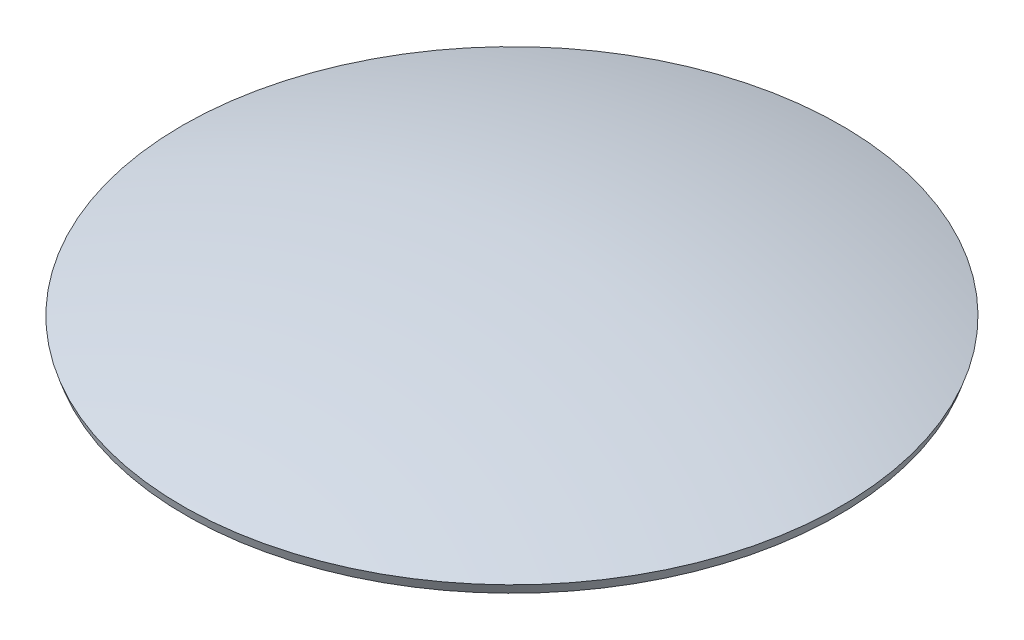
ISO-10303-21;
HEADER;
FILE_DESCRIPTION(('STEP AP214'),'2;1');
FILE_NAME('part.step','',(''),(''),'','','');
FILE_SCHEMA(('AUTOMOTIVE_DESIGN { 1 0 10303 214 1 1 1 1 }'));
ENDSEC;
DATA;
#1=APPLICATION_CONTEXT('core data for automotive mechanical design processes');
#2=APPLICATION_PROTOCOL_DEFINITION('international standard','automotive_design',2000,#1);
#3=PRODUCT_CONTEXT('',#1,'mechanical');
#4=PRODUCT('Part','Part','',(#3));
#5=PRODUCT_RELATED_PRODUCT_CATEGORY('part','',(#4));
#6=PRODUCT_DEFINITION_FORMATION('','',#4);
#7=PRODUCT_DEFINITION_CONTEXT('part definition',#1,'design');
#8=PRODUCT_DEFINITION('design','',#6,#7);
#9=PRODUCT_DEFINITION_SHAPE('','',#8);
#10=(LENGTH_UNIT() NAMED_UNIT(*) SI_UNIT(.MILLI.,.METRE.));
#11=(NAMED_UNIT(*) PLANE_ANGLE_UNIT() SI_UNIT($,.RADIAN.));
#12=(NAMED_UNIT(*) SI_UNIT($,.STERADIAN.) SOLID_ANGLE_UNIT());
#13=UNCERTAINTY_MEASURE_WITH_UNIT(LENGTH_MEASURE(1.E-05),#10,'distance_accuracy_value','');
#14=(GEOMETRIC_REPRESENTATION_CONTEXT(3) GLOBAL_UNCERTAINTY_ASSIGNED_CONTEXT((#13)) GLOBAL_UNIT_ASSIGNED_CONTEXT((#10,
#11,#12)) REPRESENTATION_CONTEXT('',''));
#15=CARTESIAN_POINT('',(0.,0.,0.));
#16=DIRECTION('',(0.,0.,1.));
#17=DIRECTION('',(1.,0.,0.));
#18=AXIS2_PLACEMENT_3D('',#15,#16,#17);
#19=CARTESIAN_POINT('',(1.54972452745581,-0.256658507293146,-1.63047473784557));
#20=CARTESIAN_POINT('',(1.53524179809765,-0.252019394786028,-1.63047473784557));
#21=CARTESIAN_POINT('',(1.52075906873949,-0.247380282278911,-1.63047473784557));
#22=CARTESIAN_POINT('',(0.,0.239749749749753,-1.63047473784557));
#23=CARTESIAN_POINT('',(-1.52075906873949,-0.247380282278911,-1.63047473784557));
#24=CARTESIAN_POINT('',(1.55124179809765,-0.252019394786028,-1.61523736892278));
#25=CARTESIAN_POINT('',(1.53674488930329,-0.247375740317364,-1.61523736892278));
#26=CARTESIAN_POINT('',(1.52224798050893,-0.2427320858487,-1.61523736892278));
#27=CARTESIAN_POINT('',(0.,0.244874874874878,-1.61523736892278));
#28=CARTESIAN_POINT('',(-1.52224798050892,-0.2427320858487,-1.61523736892278));
#29=CARTESIAN_POINT('',(1.55275906873949,-0.247380282278911,-1.6));
#30=CARTESIAN_POINT('',(1.53824798050893,-0.2427320858487,-1.6));
#31=CARTESIAN_POINT('',(1.52373689227836,-0.23808388941849,-1.6));
#32=CARTESIAN_POINT('',(0.,0.250000000000003,-1.6));
#33=CARTESIAN_POINT('',(-1.52373689227836,-0.23808388941849,-1.6));
#34=CARTESIAN_POINT('',(1.71208008008008,0.239749749749754,0.));
#35=CARTESIAN_POINT('',(1.69608008008008,0.244874874874879,0.));
#36=CARTESIAN_POINT('',(1.68008008008008,0.250000000000004,0.));
#37=CARTESIAN_POINT('',(0.,0.788163789415044,0.));
#38=CARTESIAN_POINT('',(-1.68008008008008,0.250000000000004,0.));
#39=CARTESIAN_POINT('',(1.55275906873949,-0.247380282278911,1.6));
#40=CARTESIAN_POINT('',(1.53824798050893,-0.2427320858487,1.6));
#41=CARTESIAN_POINT('',(1.52373689227836,-0.23808388941849,1.6));
#42=CARTESIAN_POINT('',(0.,0.250000000000003,1.6));
#43=CARTESIAN_POINT('',(-1.52373689227836,-0.23808388941849,1.6));
#44=CARTESIAN_POINT('',(1.55124179809765,-0.252019394786028,1.61523736892278));
#45=CARTESIAN_POINT('',(1.53674488930329,-0.247375740317364,1.61523736892278));
#46=CARTESIAN_POINT('',(1.52224798050893,-0.2427320858487,1.61523736892278));
#47=CARTESIAN_POINT('',(0.,0.244874874874878,1.61523736892278));
#48=CARTESIAN_POINT('',(-1.52224798050892,-0.2427320858487,1.61523736892278));
#49=CARTESIAN_POINT('',(1.54972452745581,-0.256658507293146,1.63047473784557));
#50=CARTESIAN_POINT('',(1.53524179809765,-0.252019394786028,1.63047473784557));
#51=CARTESIAN_POINT('',(1.52075906873949,-0.247380282278911,1.63047473784557));
#52=CARTESIAN_POINT('',(0.,0.239749749749753,1.63047473784557));
#53=CARTESIAN_POINT('',(-1.52075906873949,-0.247380282278911,1.63047473784557));
#54=(BOUNDED_SURFACE() B_SPLINE_SURFACE(2,2,((#19,#20,#21,#22,#23),(#24,#25,#26,#27,#28),(#29,
#30,#31,#32,#33),(#34,#35,#36,#37,#38),(#39,#40,#41,#42,#43),(#44,#45,#46,#47,#48),(#49,#50,#51,
#52,#53)),.UNSPECIFIED.,.F.,.F.,.F.) B_SPLINE_SURFACE_WITH_KNOTS((3,2,2,3),(3,2,3),
(-0.31619335352484,-0.309993483847882,0.309993483847882,0.31619335352484),(-0.00619986967695764,
0.,0.619986967695764),
.UNSPECIFIED.) GEOMETRIC_REPRESENTATION_ITEM() RATIONAL_B_SPLINE_SURFACE(((1.,1.,1.,
0.952335557673975,1.),(1.,1.,1.,0.952335557673975,1.),(1.,1.,1.,0.952335557673975,1.),
(0.952335557673977,0.952335557673977,0.952335557673977,0.906943014410203,0.952335557673977),(1.,
1.,1.,0.952335557673975,1.),(1.,1.,1.,0.952335557673975,1.),(1.,1.,1.,0.952335557673975,1.))) REPRESENTATION_ITEM('') SURFACE());
#55=CARTESIAN_POINT('',(0.,-5.68427344581866E-11,0.));
#56=DIRECTION('',(0.,1.,0.));
#57=DIRECTION('',(-1.,0.,0.));
#58=AXIS2_PLACEMENT_3D('',#55,#56,#57);
#59=CIRCLE('',#58,1.5999999999979);
#60=CARTESIAN_POINT('',(-1.5999999999979,-5.68434187007645E-11,0.));
#61=VERTEX_POINT('',#60);
#62=EDGE_CURVE('E19',#61,#61,#59,.T.);
#63=ORIENTED_EDGE('',*,*,#62,.F.);
#64=EDGE_LOOP('',(#63));
#65=FACE_BOUND('',#64,.T.);
#66=ADVANCED_FACE('F14',(#65),#54,.T.);
#67=CARTESIAN_POINT('',(0.,0.0473069556505841,0.));
#68=DIRECTION('',(0.,1.,0.));
#69=DIRECTION('',(-1.,0.,0.));
#70=AXIS2_PLACEMENT_3D('',#67,#68,#69);
#71=CONICAL_SURFACE('',#70,1.61621952767632,0.330297354967493);
#72=ORIENTED_EDGE('',*,*,#62,.T.);
#73=EDGE_LOOP('',(#72));
#74=FACE_BOUND('',#73,.T.);
#75=CARTESIAN_POINT('',(0.,0.0473069558779578,0.));
#76=DIRECTION('',(0.,1.,0.));
#77=DIRECTION('',(-1.,0.,0.));
#78=AXIS2_PLACEMENT_3D('',#75,#76,#77);
#79=CIRCLE('',#78,1.61621952775428);
#80=CARTESIAN_POINT('',(-1.61621952775428,0.0473069558779571,0.));
#81=VERTEX_POINT('',#80);
#82=EDGE_CURVE('E10',#81,#81,#79,.T.);
#83=ORIENTED_EDGE('',*,*,#82,.F.);
#84=EDGE_LOOP('',(#83));
#85=FACE_BOUND('',#84,.T.);
#86=ADVANCED_FACE('F31',(#74,#85),#71,.T.);
#87=CARTESIAN_POINT('',(0.,-4.995,0.));
#88=DIRECTION('',(1.,0.,0.));
#89=DIRECTION('',(0.,1.,0.));
#90=AXIS2_PLACEMENT_3D('',#87,#88,#89);
#91=SPHERICAL_SURFACE('',#90,5.295);
#92=ORIENTED_EDGE('',*,*,#82,.T.);
#93=EDGE_LOOP('',(#92));
#94=FACE_BOUND('',#93,.T.);
#95=ADVANCED_FACE('F29',(#94),#91,.T.);
#96=CLOSED_SHELL('',(#66,#86,#95));
#97=MANIFOLD_SOLID_BREP('B1',#96);
#98=ADVANCED_BREP_SHAPE_REPRESENTATION('',(#18,#97),#14);
#99=SHAPE_DEFINITION_REPRESENTATION(#9,#98);
ENDSEC;
END-ISO-10303-21;
